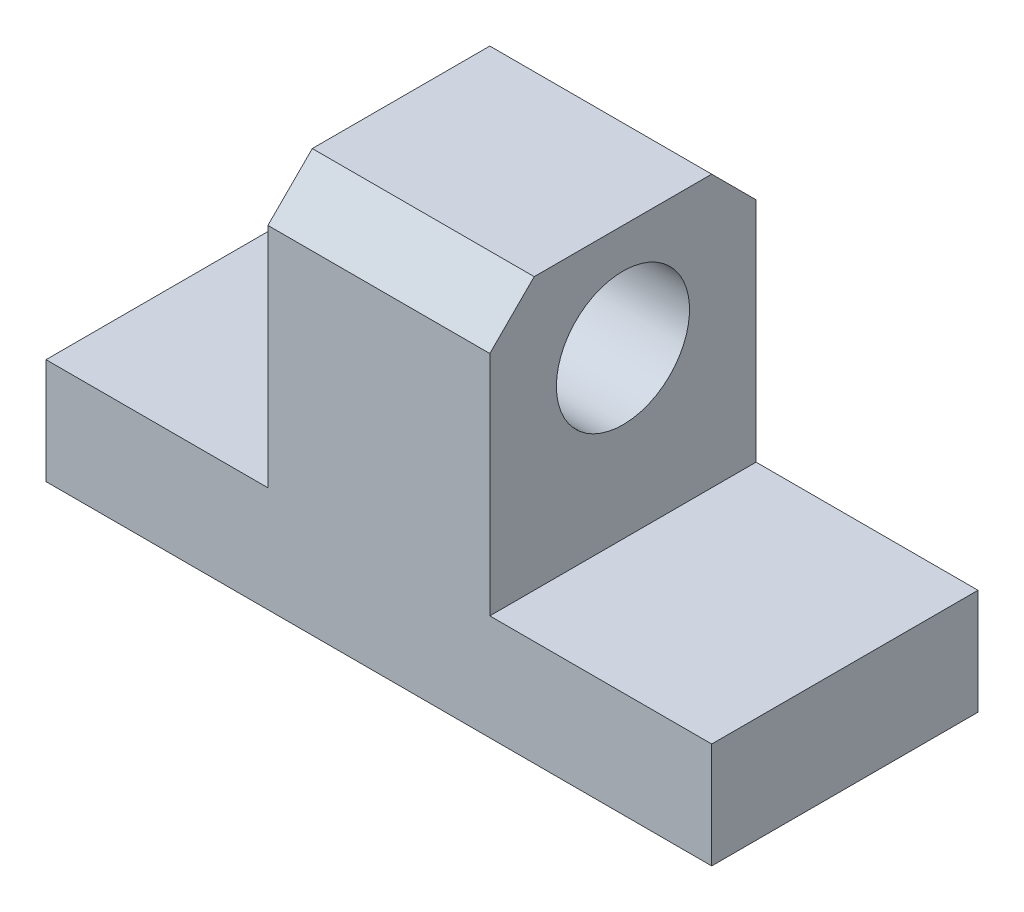
ISO-10303-21;
HEADER;
FILE_DESCRIPTION(('STEP AP214'),'2;1');
FILE_NAME('part.step','',(''),(''),'','','');
FILE_SCHEMA(('AUTOMOTIVE_DESIGN { 1 0 10303 214 1 1 1 1 }'));
ENDSEC;
DATA;
#1=APPLICATION_CONTEXT('core data for automotive mechanical design processes');
#2=APPLICATION_PROTOCOL_DEFINITION('international standard','automotive_design',2000,#1);
#3=PRODUCT_CONTEXT('',#1,'mechanical');
#4=PRODUCT('Part','Part','',(#3));
#5=PRODUCT_RELATED_PRODUCT_CATEGORY('part','',(#4));
#6=PRODUCT_DEFINITION_FORMATION('','',#4);
#7=PRODUCT_DEFINITION_CONTEXT('part definition',#1,'design');
#8=PRODUCT_DEFINITION('design','',#6,#7);
#9=PRODUCT_DEFINITION_SHAPE('','',#8);
#10=(LENGTH_UNIT() NAMED_UNIT(*) SI_UNIT(.MILLI.,.METRE.));
#11=(NAMED_UNIT(*) PLANE_ANGLE_UNIT() SI_UNIT($,.RADIAN.));
#12=(NAMED_UNIT(*) SI_UNIT($,.STERADIAN.) SOLID_ANGLE_UNIT());
#13=UNCERTAINTY_MEASURE_WITH_UNIT(LENGTH_MEASURE(1.E-05),#10,'distance_accuracy_value','');
#14=(GEOMETRIC_REPRESENTATION_CONTEXT(3) GLOBAL_UNCERTAINTY_ASSIGNED_CONTEXT((#13)) GLOBAL_UNIT_ASSIGNED_CONTEXT((#10,
#11,#12)) REPRESENTATION_CONTEXT('',''));
#15=CARTESIAN_POINT('',(0.,0.,0.));
#16=DIRECTION('',(0.,0.,1.));
#17=DIRECTION('',(1.,0.,0.));
#18=AXIS2_PLACEMENT_3D('',#15,#16,#17);
#19=CARTESIAN_POINT('',(0.846446280991737,4.76010881228939,12.));
#20=DIRECTION('',(-1.,0.,0.));
#21=DIRECTION('',(0.,0.,1.));
#22=AXIS2_PLACEMENT_3D('',#19,#20,#21);
#23=PLANE('',#22);
#24=DIRECTION('',(0.,1.,0.));
#25=VECTOR('',#24,1.);
#26=CARTESIAN_POINT('',(0.846446280991737,4.76010881228939,0.));
#27=LINE('',#26,#25);
#28=CARTESIAN_POINT('',(0.846446280991737,0.,0.));
#29=VERTEX_POINT('',#28);
#30=CARTESIAN_POINT('',(0.846446280991737,4.76010881228939,0.));
#31=VERTEX_POINT('',#30);
#32=EDGE_CURVE('E134',#29,#31,#27,.T.);
#33=ORIENTED_EDGE('',*,*,#32,.T.);
#34=DIRECTION('',(0.,0.,-1.));
#35=VECTOR('',#34,1.);
#36=CARTESIAN_POINT('',(0.846446280991737,4.76010881228939,12.));
#37=LINE('',#36,#35);
#38=CARTESIAN_POINT('',(0.846446280991737,4.76010881228939,12.));
#39=VERTEX_POINT('',#38);
#40=EDGE_CURVE('E116',#39,#31,#37,.T.);
#41=ORIENTED_EDGE('',*,*,#40,.F.);
#42=DIRECTION('',(0.,1.,0.));
#43=VECTOR('',#42,1.);
#44=CARTESIAN_POINT('',(0.846446280991737,4.76010881228939,12.));
#45=LINE('',#44,#43);
#46=CARTESIAN_POINT('',(0.846446280991737,0.,12.));
#47=VERTEX_POINT('',#46);
#48=EDGE_CURVE('E122',#47,#39,#45,.T.);
#49=ORIENTED_EDGE('',*,*,#48,.F.);
#50=DIRECTION('',(0.,0.,-1.));
#51=VECTOR('',#50,1.);
#52=CARTESIAN_POINT('',(0.846446280991737,0.,12.));
#53=LINE('',#52,#51);
#54=EDGE_CURVE('E181',#47,#29,#53,.T.);
#55=ORIENTED_EDGE('',*,*,#54,.T.);
#56=EDGE_LOOP('',(#33,#41,#49,#55));
#57=FACE_BOUND('',#56,.T.);
#58=ADVANCED_FACE('F31',(#57),#23,.F.);
#59=CARTESIAN_POINT('',(0.846446280991737,4.76010881228939,12.));
#60=DIRECTION('',(0.,-1.,0.));
#61=DIRECTION('',(0.,0.,-1.));
#62=AXIS2_PLACEMENT_3D('',#59,#60,#61);
#63=PLANE('',#62);
#64=DIRECTION('',(-1.,0.,0.));
#65=VECTOR('',#64,1.);
#66=CARTESIAN_POINT('',(0.846446280991737,4.76010881228939,0.));
#67=LINE('',#66,#65);
#68=CARTESIAN_POINT('',(-9.15355371900826,4.76010881228939,0.));
#69=VERTEX_POINT('',#68);
#70=EDGE_CURVE('E175',#31,#69,#67,.T.);
#71=ORIENTED_EDGE('',*,*,#70,.T.);
#72=DIRECTION('',(0.,0.,-1.));
#73=VECTOR('',#72,1.);
#74=CARTESIAN_POINT('',(-9.15355371900826,4.76010881228939,12.));
#75=LINE('',#74,#73);
#76=CARTESIAN_POINT('',(-9.15355371900826,4.76010881228939,12.));
#77=VERTEX_POINT('',#76);
#78=EDGE_CURVE('E119',#77,#69,#75,.T.);
#79=ORIENTED_EDGE('',*,*,#78,.F.);
#80=DIRECTION('',(-1.,0.,0.));
#81=VECTOR('',#80,1.);
#82=CARTESIAN_POINT('',(0.846446280991737,4.76010881228939,12.));
#83=LINE('',#82,#81);
#84=EDGE_CURVE('E112',#39,#77,#83,.T.);
#85=ORIENTED_EDGE('',*,*,#84,.F.);
#86=ORIENTED_EDGE('',*,*,#40,.T.);
#87=EDGE_LOOP('',(#71,#79,#85,#86));
#88=FACE_BOUND('',#87,.T.);
#89=ADVANCED_FACE('F114',(#88),#63,.F.);
#90=CARTESIAN_POINT('',(-9.15355371900826,4.76010881228939,12.));
#91=DIRECTION('',(-1.,0.,0.));
#92=DIRECTION('',(0.,0.,1.));
#93=AXIS2_PLACEMENT_3D('',#90,#91,#92);
#94=PLANE('',#93);
#95=CARTESIAN_POINT('',(-9.15355371900826,12.2170210392971,6.));
#96=DIRECTION('',(-1.,0.,0.));
#97=DIRECTION('',(0.,0.,1.));
#98=AXIS2_PLACEMENT_3D('',#95,#96,#97);
#99=CIRCLE('',#98,3.);
#100=CARTESIAN_POINT('',(-9.15355371900826,12.2170210392971,9.));
#101=VERTEX_POINT('',#100);
#102=EDGE_CURVE('E205',#101,#101,#99,.T.);
#103=ORIENTED_EDGE('',*,*,#102,.T.);
#104=EDGE_LOOP('',(#103));
#105=FACE_BOUND('',#104,.T.);
#106=DIRECTION('',(0.,1.,0.));
#107=VECTOR('',#106,1.);
#108=CARTESIAN_POINT('',(-9.15355371900826,4.76010881228939,0.));
#109=LINE('',#108,#107);
#110=CARTESIAN_POINT('',(-9.15355371900826,15.,0.));
#111=VERTEX_POINT('',#110);
#112=EDGE_CURVE('E153',#69,#111,#109,.T.);
#113=ORIENTED_EDGE('',*,*,#112,.T.);
#114=DIRECTION('',(0.,0.707106781186548,0.707106781186547));
#115=VECTOR('',#114,1.);
#116=CARTESIAN_POINT('',(-9.15355371900826,17.,1.99999999999999));
#117=LINE('',#116,#115);
#118=CARTESIAN_POINT('',(-9.15355371900826,17.,2.));
#119=VERTEX_POINT('',#118);
#120=EDGE_CURVE('E39',#111,#119,#117,.T.);
#121=ORIENTED_EDGE('',*,*,#120,.T.);
#122=DIRECTION('',(0.,0.,-1.));
#123=VECTOR('',#122,1.);
#124=CARTESIAN_POINT('',(-9.15355371900826,17.,12.));
#125=LINE('',#124,#123);
#126=CARTESIAN_POINT('',(-9.15355371900826,17.,9.99999999999999));
#127=VERTEX_POINT('',#126);
#128=EDGE_CURVE('E139',#127,#119,#125,.T.);
#129=ORIENTED_EDGE('',*,*,#128,.F.);
#130=DIRECTION('',(0.,0.707106781186546,-0.707106781186549));
#131=VECTOR('',#130,1.);
#132=CARTESIAN_POINT('',(-9.15355371900826,15.,12.));
#133=LINE('',#132,#131);
#134=CARTESIAN_POINT('',(-9.15355371900826,15.,12.));
#135=VERTEX_POINT('',#134);
#136=EDGE_CURVE('E46',#127,#135,#133,.F.);
#137=ORIENTED_EDGE('',*,*,#136,.T.);
#138=DIRECTION('',(0.,1.,0.));
#139=VECTOR('',#138,1.);
#140=CARTESIAN_POINT('',(-9.15355371900826,4.76010881228939,12.));
#141=LINE('',#140,#139);
#142=EDGE_CURVE('E121',#77,#135,#141,.T.);
#143=ORIENTED_EDGE('',*,*,#142,.F.);
#144=ORIENTED_EDGE('',*,*,#78,.T.);
#145=EDGE_LOOP('',(#113,#121,#129,#137,#143,#144));
#146=FACE_BOUND('',#145,.T.);
#147=ADVANCED_FACE('F152',(#105,#146),#94,.F.);
#148=CARTESIAN_POINT('',(-19.1535537190083,17.,12.));
#149=DIRECTION('',(0.,-1.,0.));
#150=DIRECTION('',(0.,0.,-1.));
#151=AXIS2_PLACEMENT_3D('',#148,#149,#150);
#152=PLANE('',#151);
#153=ORIENTED_EDGE('',*,*,#128,.T.);
#154=DIRECTION('',(-1.,0.,0.));
#155=VECTOR('',#154,1.);
#156=CARTESIAN_POINT('',(-19.1535537190083,17.,1.99999999999999));
#157=LINE('',#156,#155);
#158=CARTESIAN_POINT('',(-19.1535537190083,17.,2.));
#159=VERTEX_POINT('',#158);
#160=EDGE_CURVE('E137',#119,#159,#157,.T.);
#161=ORIENTED_EDGE('',*,*,#160,.T.);
#162=DIRECTION('',(0.,0.,-1.));
#163=VECTOR('',#162,1.);
#164=CARTESIAN_POINT('',(-19.1535537190083,17.,12.));
#165=LINE('',#164,#163);
#166=CARTESIAN_POINT('',(-19.1535537190083,17.,9.99999999999999));
#167=VERTEX_POINT('',#166);
#168=EDGE_CURVE('E161',#167,#159,#165,.T.);
#169=ORIENTED_EDGE('',*,*,#168,.F.);
#170=DIRECTION('',(1.,0.,0.));
#171=VECTOR('',#170,1.);
#172=CARTESIAN_POINT('',(-19.1535537190083,17.,9.99999999999999));
#173=LINE('',#172,#171);
#174=EDGE_CURVE('E135',#167,#127,#173,.T.);
#175=ORIENTED_EDGE('',*,*,#174,.T.);
#176=EDGE_LOOP('',(#153,#161,#169,#175));
#177=FACE_BOUND('',#176,.T.);
#178=ADVANCED_FACE('F157',(#177),#152,.F.);
#179=CARTESIAN_POINT('',(-19.1535537190083,4.76010881228939,12.));
#180=DIRECTION('',(1.,0.,0.));
#181=DIRECTION('',(0.,0.,-1.));
#182=AXIS2_PLACEMENT_3D('',#179,#180,#181);
#183=PLANE('',#182);
#184=CARTESIAN_POINT('',(-19.1535537190083,12.2170210392971,6.));
#185=DIRECTION('',(-1.,0.,0.));
#186=DIRECTION('',(0.,0.,1.));
#187=AXIS2_PLACEMENT_3D('',#184,#185,#186);
#188=CIRCLE('',#187,3.);
#189=CARTESIAN_POINT('',(-19.1535537190083,12.2170210392971,9.));
#190=VERTEX_POINT('',#189);
#191=EDGE_CURVE('E323',#190,#190,#188,.T.);
#192=ORIENTED_EDGE('',*,*,#191,.F.);
#193=EDGE_LOOP('',(#192));
#194=FACE_BOUND('',#193,.T.);
#195=ORIENTED_EDGE('',*,*,#168,.T.);
#196=DIRECTION('',(0.,-0.707106781186548,-0.707106781186547));
#197=VECTOR('',#196,1.);
#198=CARTESIAN_POINT('',(-19.1535537190083,17.,1.99999999999999));
#199=LINE('',#198,#197);
#200=CARTESIAN_POINT('',(-19.1535537190083,15.,0.));
#201=VERTEX_POINT('',#200);
#202=EDGE_CURVE('E147',#159,#201,#199,.T.);
#203=ORIENTED_EDGE('',*,*,#202,.T.);
#204=DIRECTION('',(0.,-1.,0.));
#205=VECTOR('',#204,1.);
#206=CARTESIAN_POINT('',(-19.1535537190083,4.76010881228939,0.));
#207=LINE('',#206,#205);
#208=CARTESIAN_POINT('',(-19.1535537190083,4.76010881228939,0.));
#209=VERTEX_POINT('',#208);
#210=EDGE_CURVE('E166',#201,#209,#207,.T.);
#211=ORIENTED_EDGE('',*,*,#210,.T.);
#212=DIRECTION('',(0.,0.,-1.));
#213=VECTOR('',#212,1.);
#214=CARTESIAN_POINT('',(-19.1535537190083,4.76010881228939,12.));
#215=LINE('',#214,#213);
#216=CARTESIAN_POINT('',(-19.1535537190083,4.76010881228939,12.));
#217=VERTEX_POINT('',#216);
#218=EDGE_CURVE('E189',#217,#209,#215,.T.);
#219=ORIENTED_EDGE('',*,*,#218,.F.);
#220=DIRECTION('',(0.,-1.,0.));
#221=VECTOR('',#220,1.);
#222=CARTESIAN_POINT('',(-19.1535537190083,4.76010881228939,12.));
#223=LINE('',#222,#221);
#224=CARTESIAN_POINT('',(-19.1535537190083,15.,12.));
#225=VERTEX_POINT('',#224);
#226=EDGE_CURVE('E197',#225,#217,#223,.T.);
#227=ORIENTED_EDGE('',*,*,#226,.F.);
#228=DIRECTION('',(0.,-0.707106781186546,0.707106781186549));
#229=VECTOR('',#228,1.);
#230=CARTESIAN_POINT('',(-19.1535537190083,15.,12.));
#231=LINE('',#230,#229);
#232=EDGE_CURVE('E145',#225,#167,#231,.F.);
#233=ORIENTED_EDGE('',*,*,#232,.T.);
#234=EDGE_LOOP('',(#195,#203,#211,#219,#227,#233));
#235=FACE_BOUND('',#234,.T.);
#236=ADVANCED_FACE('F164',(#194,#235),#183,.F.);
#237=CARTESIAN_POINT('',(-29.1535537190083,4.76010881228939,12.));
#238=DIRECTION('',(0.,-1.,0.));
#239=DIRECTION('',(0.,0.,-1.));
#240=AXIS2_PLACEMENT_3D('',#237,#238,#239);
#241=PLANE('',#240);
#242=DIRECTION('',(-1.,0.,0.));
#243=VECTOR('',#242,1.);
#244=CARTESIAN_POINT('',(-29.1535537190083,4.76010881228939,0.));
#245=LINE('',#244,#243);
#246=CARTESIAN_POINT('',(-29.1535537190083,4.76010881228939,0.));
#247=VERTEX_POINT('',#246);
#248=EDGE_CURVE('E171',#209,#247,#245,.T.);
#249=ORIENTED_EDGE('',*,*,#248,.T.);
#250=DIRECTION('',(0.,0.,-1.));
#251=VECTOR('',#250,1.);
#252=CARTESIAN_POINT('',(-29.1535537190083,4.76010881228939,12.));
#253=LINE('',#252,#251);
#254=CARTESIAN_POINT('',(-29.1535537190083,4.76010881228939,12.));
#255=VERTEX_POINT('',#254);
#256=EDGE_CURVE('E186',#255,#247,#253,.T.);
#257=ORIENTED_EDGE('',*,*,#256,.F.);
#258=DIRECTION('',(-1.,0.,0.));
#259=VECTOR('',#258,1.);
#260=CARTESIAN_POINT('',(-29.1535537190083,4.76010881228939,12.));
#261=LINE('',#260,#259);
#262=EDGE_CURVE('E195',#217,#255,#261,.T.);
#263=ORIENTED_EDGE('',*,*,#262,.F.);
#264=ORIENTED_EDGE('',*,*,#218,.T.);
#265=EDGE_LOOP('',(#249,#257,#263,#264));
#266=FACE_BOUND('',#265,.T.);
#267=ADVANCED_FACE('F193',(#266),#241,.F.);
#268=CARTESIAN_POINT('',(-29.1535537190083,4.76010881228939,12.));
#269=DIRECTION('',(1.,0.,0.));
#270=DIRECTION('',(0.,0.,-1.));
#271=AXIS2_PLACEMENT_3D('',#268,#269,#270);
#272=PLANE('',#271);
#273=DIRECTION('',(0.,-1.,0.));
#274=VECTOR('',#273,1.);
#275=CARTESIAN_POINT('',(-29.1535537190083,4.76010881228939,0.));
#276=LINE('',#275,#274);
#277=CARTESIAN_POINT('',(-29.1535537190083,0.,0.));
#278=VERTEX_POINT('',#277);
#279=EDGE_CURVE('E173',#247,#278,#276,.T.);
#280=ORIENTED_EDGE('',*,*,#279,.T.);
#281=DIRECTION('',(0.,0.,-1.));
#282=VECTOR('',#281,1.);
#283=CARTESIAN_POINT('',(-29.1535537190083,0.,12.));
#284=LINE('',#283,#282);
#285=CARTESIAN_POINT('',(-29.1535537190083,0.,12.));
#286=VERTEX_POINT('',#285);
#287=EDGE_CURVE('E183',#286,#278,#284,.T.);
#288=ORIENTED_EDGE('',*,*,#287,.F.);
#289=DIRECTION('',(0.,-1.,0.));
#290=VECTOR('',#289,1.);
#291=CARTESIAN_POINT('',(-29.1535537190083,4.76010881228939,12.));
#292=LINE('',#291,#290);
#293=EDGE_CURVE('E199',#255,#286,#292,.T.);
#294=ORIENTED_EDGE('',*,*,#293,.F.);
#295=ORIENTED_EDGE('',*,*,#256,.T.);
#296=EDGE_LOOP('',(#280,#288,#294,#295));
#297=FACE_BOUND('',#296,.T.);
#298=ADVANCED_FACE('F233',(#297),#272,.F.);
#299=CARTESIAN_POINT('',(0.846446280991737,0.,12.));
#300=DIRECTION('',(0.,1.,0.));
#301=DIRECTION('',(-1.,0.,0.));
#302=AXIS2_PLACEMENT_3D('',#299,#300,#301);
#303=PLANE('',#302);
#304=DIRECTION('',(1.,0.,0.));
#305=VECTOR('',#304,1.);
#306=CARTESIAN_POINT('',(0.846446280991737,0.,0.));
#307=LINE('',#306,#305);
#308=EDGE_CURVE('E131',#278,#29,#307,.T.);
#309=ORIENTED_EDGE('',*,*,#308,.T.);
#310=ORIENTED_EDGE('',*,*,#54,.F.);
#311=DIRECTION('',(1.,0.,0.));
#312=VECTOR('',#311,1.);
#313=CARTESIAN_POINT('',(0.846446280991737,0.,12.));
#314=LINE('',#313,#312);
#315=EDGE_CURVE('E127',#286,#47,#314,.T.);
#316=ORIENTED_EDGE('',*,*,#315,.F.);
#317=ORIENTED_EDGE('',*,*,#287,.T.);
#318=EDGE_LOOP('',(#309,#310,#316,#317));
#319=FACE_BOUND('',#318,.T.);
#320=ADVANCED_FACE('F236',(#319),#303,.F.);
#321=CARTESIAN_POINT('',(0.846446280991737,0.,12.));
#322=DIRECTION('',(0.,0.,-1.));
#323=DIRECTION('',(-1.,0.,0.));
#324=AXIS2_PLACEMENT_3D('',#321,#322,#323);
#325=PLANE('',#324);
#326=ORIENTED_EDGE('',*,*,#142,.T.);
#327=DIRECTION('',(-1.,0.,0.));
#328=VECTOR('',#327,1.);
#329=CARTESIAN_POINT('',(0.846446280991737,15.,12.));
#330=LINE('',#329,#328);
#331=EDGE_CURVE('E11',#135,#225,#330,.T.);
#332=ORIENTED_EDGE('',*,*,#331,.T.);
#333=ORIENTED_EDGE('',*,*,#226,.T.);
#334=ORIENTED_EDGE('',*,*,#262,.T.);
#335=ORIENTED_EDGE('',*,*,#293,.T.);
#336=ORIENTED_EDGE('',*,*,#315,.T.);
#337=ORIENTED_EDGE('',*,*,#48,.T.);
#338=ORIENTED_EDGE('',*,*,#84,.T.);
#339=EDGE_LOOP('',(#326,#332,#333,#334,#335,#336,#337,#338));
#340=FACE_BOUND('',#339,.T.);
#341=ADVANCED_FACE('F125',(#340),#325,.F.);
#342=CARTESIAN_POINT('',(0.846446280991737,0.,0.));
#343=DIRECTION('',(0.,0.,-1.));
#344=DIRECTION('',(-1.,0.,0.));
#345=AXIS2_PLACEMENT_3D('',#342,#343,#344);
#346=PLANE('',#345);
#347=ORIENTED_EDGE('',*,*,#210,.F.);
#348=DIRECTION('',(1.,0.,0.));
#349=VECTOR('',#348,1.);
#350=CARTESIAN_POINT('',(-9.15355371900826,15.,0.));
#351=LINE('',#350,#349);
#352=EDGE_CURVE('E54',#201,#111,#351,.T.);
#353=ORIENTED_EDGE('',*,*,#352,.T.);
#354=ORIENTED_EDGE('',*,*,#112,.F.);
#355=ORIENTED_EDGE('',*,*,#70,.F.);
#356=ORIENTED_EDGE('',*,*,#32,.F.);
#357=ORIENTED_EDGE('',*,*,#308,.F.);
#358=ORIENTED_EDGE('',*,*,#279,.F.);
#359=ORIENTED_EDGE('',*,*,#248,.F.);
#360=EDGE_LOOP('',(#347,#353,#354,#355,#356,#357,#358,#359));
#361=FACE_BOUND('',#360,.T.);
#362=ADVANCED_FACE('F169',(#361),#346,.T.);
#363=CARTESIAN_POINT('',(-19.1535537190083,17.,1.99999999999999));
#364=DIRECTION('',(0.,0.707106781186547,-0.707106781186548));
#365=DIRECTION('',(0.,0.707106781186548,0.707106781186547));
#366=AXIS2_PLACEMENT_3D('',#363,#364,#365);
#367=PLANE('',#366);
#368=ORIENTED_EDGE('',*,*,#120,.F.);
#369=ORIENTED_EDGE('',*,*,#352,.F.);
#370=ORIENTED_EDGE('',*,*,#202,.F.);
#371=ORIENTED_EDGE('',*,*,#160,.F.);
#372=EDGE_LOOP('',(#368,#369,#370,#371));
#373=FACE_BOUND('',#372,.T.);
#374=ADVANCED_FACE('F162',(#373),#367,.T.);
#375=CARTESIAN_POINT('',(0.846446280991737,15.,12.));
#376=DIRECTION('',(0.,-0.707106781186549,-0.707106781186546));
#377=DIRECTION('',(0.,0.707106781186546,-0.707106781186549));
#378=AXIS2_PLACEMENT_3D('',#375,#376,#377);
#379=PLANE('',#378);
#380=ORIENTED_EDGE('',*,*,#136,.F.);
#381=ORIENTED_EDGE('',*,*,#174,.F.);
#382=ORIENTED_EDGE('',*,*,#232,.F.);
#383=ORIENTED_EDGE('',*,*,#331,.F.);
#384=EDGE_LOOP('',(#380,#381,#382,#383));
#385=FACE_BOUND('',#384,.T.);
#386=ADVANCED_FACE('F33',(#385),#379,.F.);
#387=CARTESIAN_POINT('',(0.846446280991737,12.2170210392971,6.));
#388=DIRECTION('',(-1.,0.,0.));
#389=DIRECTION('',(0.,0.,1.));
#390=AXIS2_PLACEMENT_3D('',#387,#388,#389);
#391=CYLINDRICAL_SURFACE('',#390,3.);
#392=ORIENTED_EDGE('',*,*,#191,.T.);
#393=EDGE_LOOP('',(#392));
#394=FACE_BOUND('',#393,.T.);
#395=ORIENTED_EDGE('',*,*,#102,.F.);
#396=EDGE_LOOP('',(#395));
#397=FACE_BOUND('',#396,.T.);
#398=ADVANCED_FACE('F209',(#394,#397),#391,.F.);
#399=CLOSED_SHELL('',(#58,#89,#147,#178,#236,#267,#298,#320,#341,#362,#374,#386,#398));
#400=MANIFOLD_SOLID_BREP('B2',#399);
#401=ADVANCED_BREP_SHAPE_REPRESENTATION('',(#18,#400),#14);
#402=SHAPE_DEFINITION_REPRESENTATION(#9,#401);
ENDSEC;
END-ISO-10303-21;
